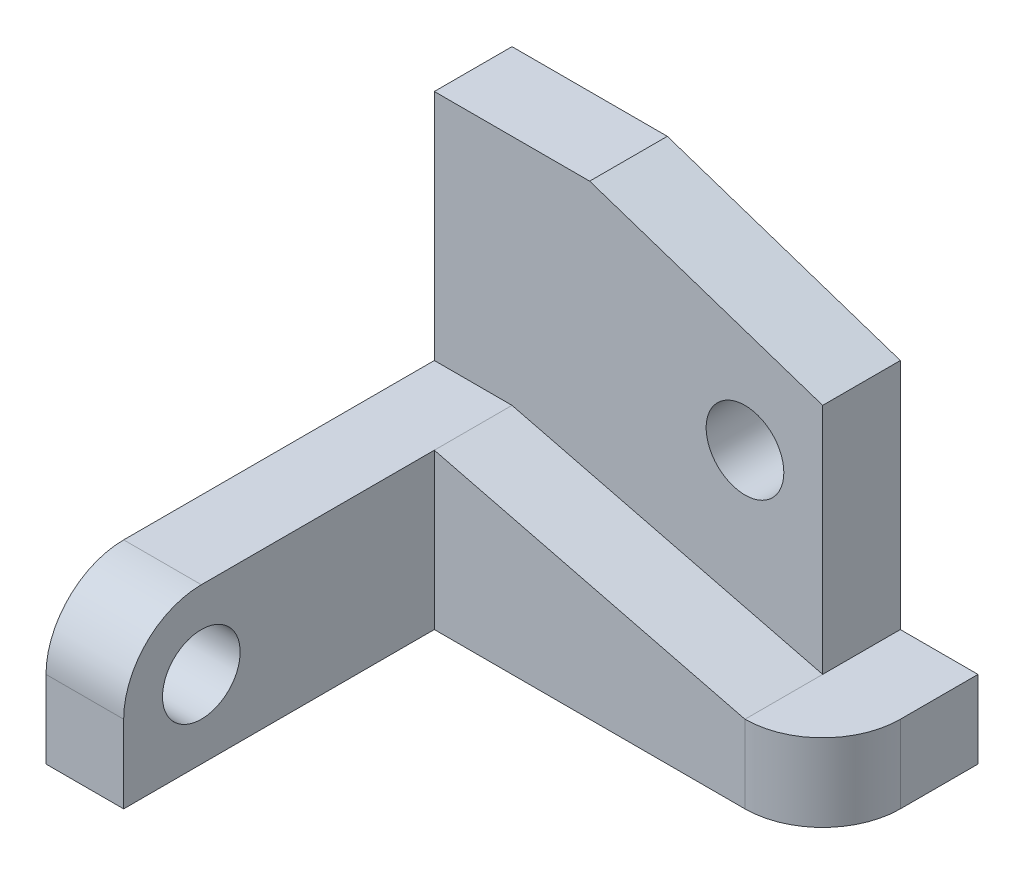
ISO-10303-21;
HEADER;
FILE_DESCRIPTION(('STEP AP214'),'2;1');
FILE_NAME('part.step','',(''),(''),'','','');
FILE_SCHEMA(('AUTOMOTIVE_DESIGN { 1 0 10303 214 1 1 1 1 }'));
ENDSEC;
DATA;
#1=APPLICATION_CONTEXT('core data for automotive mechanical design processes');
#2=APPLICATION_PROTOCOL_DEFINITION('international standard','automotive_design',2000,#1);
#3=PRODUCT_CONTEXT('',#1,'mechanical');
#4=PRODUCT('Part','Part','',(#3));
#5=PRODUCT_RELATED_PRODUCT_CATEGORY('part','',(#4));
#6=PRODUCT_DEFINITION_FORMATION('','',#4);
#7=PRODUCT_DEFINITION_CONTEXT('part definition',#1,'design');
#8=PRODUCT_DEFINITION('design','',#6,#7);
#9=PRODUCT_DEFINITION_SHAPE('','',#8);
#10=(LENGTH_UNIT() NAMED_UNIT(*) SI_UNIT(.MILLI.,.METRE.));
#11=(NAMED_UNIT(*) PLANE_ANGLE_UNIT() SI_UNIT($,.RADIAN.));
#12=(NAMED_UNIT(*) SI_UNIT($,.STERADIAN.) SOLID_ANGLE_UNIT());
#13=UNCERTAINTY_MEASURE_WITH_UNIT(LENGTH_MEASURE(1.E-05),#10,'distance_accuracy_value','');
#14=(GEOMETRIC_REPRESENTATION_CONTEXT(3) GLOBAL_UNCERTAINTY_ASSIGNED_CONTEXT((#13)) GLOBAL_UNIT_ASSIGNED_CONTEXT((#10,
#11,#12)) REPRESENTATION_CONTEXT('',''));
#15=CARTESIAN_POINT('',(0.,0.,0.));
#16=DIRECTION('',(0.,0.,1.));
#17=DIRECTION('',(1.,0.,0.));
#18=AXIS2_PLACEMENT_3D('',#15,#16,#17);
#19=CARTESIAN_POINT('',(-38.1619937694704,-27.7258566978193,10.));
#20=DIRECTION('',(0.,1.,0.));
#21=DIRECTION('',(0.,0.,1.));
#22=AXIS2_PLACEMENT_3D('',#19,#20,#21);
#23=PLANE('',#22);
#24=CARTESIAN_POINT('',(11.8380062305296,-27.7258566978193,10.));
#25=DIRECTION('',(0.,1.,0.));
#26=DIRECTION('',(0.,0.,1.));
#27=AXIS2_PLACEMENT_3D('',#24,#25,#26);
#28=CIRCLE('',#27,10.);
#29=CARTESIAN_POINT('',(11.8380062305295,-27.7258566978193,20.));
#30=VERTEX_POINT('',#29);
#31=CARTESIAN_POINT('',(21.8380062305296,-27.7258566978193,9.99999999999993));
#32=VERTEX_POINT('',#31);
#33=EDGE_CURVE('E150',#30,#32,#28,.T.);
#34=ORIENTED_EDGE('',*,*,#33,.F.);
#35=DIRECTION('',(1.,0.,0.));
#36=VECTOR('',#35,1.);
#37=CARTESIAN_POINT('',(-28.1619937694704,-27.7258566978193,20.));
#38=LINE('',#37,#36);
#39=CARTESIAN_POINT('',(-28.1619937694704,-27.7258566978193,20.));
#40=VERTEX_POINT('',#39);
#41=EDGE_CURVE('E181',#40,#30,#38,.T.);
#42=ORIENTED_EDGE('',*,*,#41,.F.);
#43=DIRECTION('',(0.,0.,1.));
#44=VECTOR('',#43,1.);
#45=CARTESIAN_POINT('',(-28.1619937694704,-27.7258566978193,10.));
#46=LINE('',#45,#44);
#47=CARTESIAN_POINT('',(-28.1619937694704,-27.7258566978193,60.));
#48=VERTEX_POINT('',#47);
#49=EDGE_CURVE('E194',#40,#48,#46,.T.);
#50=ORIENTED_EDGE('',*,*,#49,.T.);
#51=DIRECTION('',(-1.,0.,0.));
#52=VECTOR('',#51,1.);
#53=CARTESIAN_POINT('',(-28.1619937694704,-27.7258566978193,60.));
#54=LINE('',#53,#52);
#55=CARTESIAN_POINT('',(-38.1619937694704,-27.7258566978193,60.));
#56=VERTEX_POINT('',#55);
#57=EDGE_CURVE('E211',#48,#56,#54,.T.);
#58=ORIENTED_EDGE('',*,*,#57,.T.);
#59=DIRECTION('',(0.,0.,-1.));
#60=VECTOR('',#59,1.);
#61=CARTESIAN_POINT('',(-38.1619937694704,-27.7258566978193,10.));
#62=LINE('',#61,#60);
#63=CARTESIAN_POINT('',(-38.1619937694704,-27.7258566978193,0.));
#64=VERTEX_POINT('',#63);
#65=EDGE_CURVE('E272',#56,#64,#62,.T.);
#66=ORIENTED_EDGE('',*,*,#65,.T.);
#67=DIRECTION('',(1.,0.,0.));
#68=VECTOR('',#67,1.);
#69=CARTESIAN_POINT('',(-38.1619937694704,-27.7258566978193,0.));
#70=LINE('',#69,#68);
#71=CARTESIAN_POINT('',(21.8380062305296,-27.7258566978193,0.));
#72=VERTEX_POINT('',#71);
#73=EDGE_CURVE('E259',#64,#72,#70,.T.);
#74=ORIENTED_EDGE('',*,*,#73,.T.);
#75=DIRECTION('',(0.,0.,1.));
#76=VECTOR('',#75,1.);
#77=CARTESIAN_POINT('',(21.8380062305296,-27.7258566978193,0.));
#78=LINE('',#77,#76);
#79=EDGE_CURVE('E172',#72,#32,#78,.T.);
#80=ORIENTED_EDGE('',*,*,#79,.T.);
#81=EDGE_LOOP('',(#34,#42,#50,#58,#66,#74,#80));
#82=FACE_BOUND('',#81,.T.);
#83=ADVANCED_FACE('F40',(#82),#23,.F.);
#84=CARTESIAN_POINT('',(21.8380062305296,-17.7258566978193,0.));
#85=DIRECTION('',(0.,1.,0.));
#86=DIRECTION('',(0.,0.,1.));
#87=AXIS2_PLACEMENT_3D('',#84,#85,#86);
#88=PLANE('',#87);
#89=DIRECTION('',(0.,0.,1.));
#90=VECTOR('',#89,1.);
#91=CARTESIAN_POINT('',(11.8380062305296,-17.7258566978193,0.));
#92=LINE('',#91,#90);
#93=CARTESIAN_POINT('',(11.8380062305296,-17.7258566978193,10.));
#94=VERTEX_POINT('',#93);
#95=CARTESIAN_POINT('',(11.8380062305296,-17.7258566978193,20.));
#96=VERTEX_POINT('',#95);
#97=EDGE_CURVE('E163',#94,#96,#92,.T.);
#98=ORIENTED_EDGE('',*,*,#97,.T.);
#99=CARTESIAN_POINT('',(11.8380062305296,-17.7258566978193,10.));
#100=DIRECTION('',(0.,1.,0.));
#101=DIRECTION('',(0.,0.,-1.));
#102=AXIS2_PLACEMENT_3D('',#99,#100,#101);
#103=CIRCLE('',#102,10.);
#104=CARTESIAN_POINT('',(21.8380062305296,-17.7258566978193,9.99999999999993));
#105=VERTEX_POINT('',#104);
#106=EDGE_CURVE('E148',#96,#105,#103,.T.);
#107=ORIENTED_EDGE('',*,*,#106,.T.);
#108=DIRECTION('',(0.,0.,1.));
#109=VECTOR('',#108,1.);
#110=CARTESIAN_POINT('',(21.8380062305296,-17.7258566978193,0.));
#111=LINE('',#110,#109);
#112=CARTESIAN_POINT('',(21.8380062305296,-17.7258566978193,0.));
#113=VERTEX_POINT('',#112);
#114=EDGE_CURVE('E160',#113,#105,#111,.T.);
#115=ORIENTED_EDGE('',*,*,#114,.F.);
#116=DIRECTION('',(-1.,0.,0.));
#117=VECTOR('',#116,1.);
#118=CARTESIAN_POINT('',(21.8380062305296,-17.7258566978193,0.));
#119=LINE('',#118,#117);
#120=CARTESIAN_POINT('',(11.8380062305296,-17.7258566978193,0.));
#121=VERTEX_POINT('',#120);
#122=EDGE_CURVE('E481',#113,#121,#119,.T.);
#123=ORIENTED_EDGE('',*,*,#122,.T.);
#124=EDGE_CURVE('E178',#121,#94,#92,.T.);
#125=ORIENTED_EDGE('',*,*,#124,.T.);
#126=EDGE_LOOP('',(#98,#107,#115,#123,#125));
#127=FACE_BOUND('',#126,.T.);
#128=ADVANCED_FACE('F159',(#127),#88,.T.);
#129=CARTESIAN_POINT('',(0.,0.,10.));
#130=DIRECTION('',(0.,0.,1.));
#131=DIRECTION('',(1.,0.,0.));
#132=AXIS2_PLACEMENT_3D('',#129,#130,#131);
#133=PLANE('',#132);
#134=DIRECTION('',(-0.970142500145332,0.242535625036333,0.));
#135=VECTOR('',#134,1.);
#136=CARTESIAN_POINT('',(-3.47443650357339,-13.8977460142936,10.));
#137=LINE('',#136,#135);
#138=CARTESIAN_POINT('',(-28.1619937694704,-7.72585669781932,9.99999999999999));
#139=VERTEX_POINT('',#138);
#140=EDGE_CURVE('E171',#94,#139,#137,.T.);
#141=ORIENTED_EDGE('',*,*,#140,.F.);
#142=DIRECTION('',(0.,1.,0.));
#143=VECTOR('',#142,1.);
#144=CARTESIAN_POINT('',(11.8380062305296,-27.7258566978193,10.));
#145=LINE('',#144,#143);
#146=CARTESIAN_POINT('',(11.8380062305296,12.2741433021807,10.));
#147=VERTEX_POINT('',#146);
#148=EDGE_CURVE('E247',#94,#147,#145,.T.);
#149=ORIENTED_EDGE('',*,*,#148,.T.);
#150=DIRECTION('',(-0.948683298050514,0.316227766016838,0.));
#151=VECTOR('',#150,1.);
#152=CARTESIAN_POINT('',(11.8380062305296,12.2741433021807,10.));
#153=LINE('',#152,#151);
#154=CARTESIAN_POINT('',(-18.1619937694704,22.2741433021807,10.));
#155=VERTEX_POINT('',#154);
#156=EDGE_CURVE('E64',#147,#155,#153,.T.);
#157=ORIENTED_EDGE('',*,*,#156,.T.);
#158=DIRECTION('',(-1.,0.,0.));
#159=VECTOR('',#158,1.);
#160=CARTESIAN_POINT('',(-18.1619937694704,22.2741433021807,10.));
#161=LINE('',#160,#159);
#162=CARTESIAN_POINT('',(-38.1619937694704,22.2741433021807,10.));
#163=VERTEX_POINT('',#162);
#164=EDGE_CURVE('E242',#155,#163,#161,.T.);
#165=ORIENTED_EDGE('',*,*,#164,.T.);
#166=DIRECTION('',(0.,-1.,0.));
#167=VECTOR('',#166,1.);
#168=CARTESIAN_POINT('',(-38.1619937694704,22.2741433021807,10.));
#169=LINE('',#168,#167);
#170=CARTESIAN_POINT('',(-38.1619937694704,-7.72585669781932,10.));
#171=VERTEX_POINT('',#170);
#172=EDGE_CURVE('E91',#163,#171,#169,.T.);
#173=ORIENTED_EDGE('',*,*,#172,.T.);
#174=DIRECTION('',(-1.,0.,0.));
#175=VECTOR('',#174,1.);
#176=CARTESIAN_POINT('',(-28.1619937694704,-7.72585669781932,10.));
#177=LINE('',#176,#175);
#178=EDGE_CURVE('E221',#139,#171,#177,.T.);
#179=ORIENTED_EDGE('',*,*,#178,.F.);
#180=EDGE_LOOP('',(#141,#149,#157,#165,#173,#179));
#181=FACE_BOUND('',#180,.T.);
#182=CARTESIAN_POINT('',(1.83800623052959,2.27414330218068,10.));
#183=DIRECTION('',(0.,0.,1.));
#184=DIRECTION('',(1.,0.,0.));
#185=AXIS2_PLACEMENT_3D('',#182,#183,#184);
#186=CIRCLE('',#185,5.);
#187=CARTESIAN_POINT('',(6.8380062305296,2.27414330218068,10.));
#188=VERTEX_POINT('',#187);
#189=EDGE_CURVE('E234',#188,#188,#186,.T.);
#190=ORIENTED_EDGE('',*,*,#189,.F.);
#191=EDGE_LOOP('',(#190));
#192=FACE_BOUND('',#191,.T.);
#193=ADVANCED_FACE('F304',(#181,#192),#133,.T.);
#194=CARTESIAN_POINT('',(0.,0.,0.));
#195=DIRECTION('',(0.,0.,1.));
#196=DIRECTION('',(1.,0.,0.));
#197=AXIS2_PLACEMENT_3D('',#194,#195,#196);
#198=PLANE('',#197);
#199=DIRECTION('',(0.,1.,0.));
#200=VECTOR('',#199,1.);
#201=CARTESIAN_POINT('',(11.8380062305296,-27.7258566978193,0.));
#202=LINE('',#201,#200);
#203=CARTESIAN_POINT('',(11.8380062305296,12.2741433021807,0.));
#204=VERTEX_POINT('',#203);
#205=EDGE_CURVE('E262',#121,#204,#202,.T.);
#206=ORIENTED_EDGE('',*,*,#205,.F.);
#207=ORIENTED_EDGE('',*,*,#122,.F.);
#208=DIRECTION('',(0.,1.,0.));
#209=VECTOR('',#208,1.);
#210=CARTESIAN_POINT('',(21.8380062305296,-27.7258566978193,0.));
#211=LINE('',#210,#209);
#212=EDGE_CURVE('E169',#72,#113,#211,.T.);
#213=ORIENTED_EDGE('',*,*,#212,.F.);
#214=ORIENTED_EDGE('',*,*,#73,.F.);
#215=DIRECTION('',(0.,-1.,0.));
#216=VECTOR('',#215,1.);
#217=CARTESIAN_POINT('',(-38.1619937694704,22.2741433021807,0.));
#218=LINE('',#217,#216);
#219=CARTESIAN_POINT('',(-38.1619937694704,22.2741433021807,0.));
#220=VERTEX_POINT('',#219);
#221=EDGE_CURVE('E256',#220,#64,#218,.T.);
#222=ORIENTED_EDGE('',*,*,#221,.F.);
#223=DIRECTION('',(-1.,0.,0.));
#224=VECTOR('',#223,1.);
#225=CARTESIAN_POINT('',(-18.1619937694704,22.2741433021807,0.));
#226=LINE('',#225,#224);
#227=CARTESIAN_POINT('',(-18.1619937694704,22.2741433021807,0.));
#228=VERTEX_POINT('',#227);
#229=EDGE_CURVE('E238',#228,#220,#226,.T.);
#230=ORIENTED_EDGE('',*,*,#229,.F.);
#231=DIRECTION('',(-0.948683298050514,0.316227766016838,0.));
#232=VECTOR('',#231,1.);
#233=CARTESIAN_POINT('',(11.8380062305296,12.2741433021807,0.));
#234=LINE('',#233,#232);
#235=EDGE_CURVE('E84',#204,#228,#234,.T.);
#236=ORIENTED_EDGE('',*,*,#235,.F.);
#237=EDGE_LOOP('',(#206,#207,#213,#214,#222,#230,#236));
#238=FACE_BOUND('',#237,.T.);
#239=CARTESIAN_POINT('',(1.83800623052959,2.27414330218068,0.));
#240=DIRECTION('',(0.,0.,1.));
#241=DIRECTION('',(1.,0.,0.));
#242=AXIS2_PLACEMENT_3D('',#239,#240,#241);
#243=CIRCLE('',#242,5.);
#244=CARTESIAN_POINT('',(6.8380062305296,2.27414330218068,0.));
#245=VERTEX_POINT('',#244);
#246=EDGE_CURVE('E224',#245,#245,#243,.T.);
#247=ORIENTED_EDGE('',*,*,#246,.T.);
#248=EDGE_LOOP('',(#247));
#249=FACE_BOUND('',#248,.T.);
#250=ADVANCED_FACE('F284',(#238,#249),#198,.F.);
#251=CARTESIAN_POINT('',(-18.1619937694704,22.2741433021807,10.));
#252=DIRECTION('',(0.,-1.,0.));
#253=DIRECTION('',(0.,0.,-1.));
#254=AXIS2_PLACEMENT_3D('',#251,#252,#253);
#255=PLANE('',#254);
#256=ORIENTED_EDGE('',*,*,#229,.T.);
#257=DIRECTION('',(0.,0.,-1.));
#258=VECTOR('',#257,1.);
#259=CARTESIAN_POINT('',(-38.1619937694704,22.2741433021807,10.));
#260=LINE('',#259,#258);
#261=EDGE_CURVE('E49',#163,#220,#260,.T.);
#262=ORIENTED_EDGE('',*,*,#261,.F.);
#263=ORIENTED_EDGE('',*,*,#164,.F.);
#264=DIRECTION('',(0.,0.,-1.));
#265=VECTOR('',#264,1.);
#266=CARTESIAN_POINT('',(-18.1619937694704,22.2741433021807,10.));
#267=LINE('',#266,#265);
#268=EDGE_CURVE('E252',#155,#228,#267,.T.);
#269=ORIENTED_EDGE('',*,*,#268,.T.);
#270=EDGE_LOOP('',(#256,#262,#263,#269));
#271=FACE_BOUND('',#270,.T.);
#272=ADVANCED_FACE('F42',(#271),#255,.F.);
#273=CARTESIAN_POINT('',(-38.1619937694704,22.2741433021807,10.));
#274=DIRECTION('',(1.,0.,0.));
#275=DIRECTION('',(0.,0.,-1.));
#276=AXIS2_PLACEMENT_3D('',#273,#274,#275);
#277=PLANE('',#276);
#278=ORIENTED_EDGE('',*,*,#221,.T.);
#279=ORIENTED_EDGE('',*,*,#65,.F.);
#280=DIRECTION('',(0.,1.,0.));
#281=VECTOR('',#280,1.);
#282=CARTESIAN_POINT('',(-38.1619937694704,-17.7258566978194,60.));
#283=LINE('',#282,#281);
#284=CARTESIAN_POINT('',(-38.1619937694704,-17.7258566978194,60.));
#285=VERTEX_POINT('',#284);
#286=EDGE_CURVE('E190',#56,#285,#283,.T.);
#287=ORIENTED_EDGE('',*,*,#286,.T.);
#288=CARTESIAN_POINT('',(-38.1619937694704,-17.7258566978193,50.));
#289=DIRECTION('',(-1.,0.,0.));
#290=DIRECTION('',(0.,0.,1.));
#291=AXIS2_PLACEMENT_3D('',#288,#289,#290);
#292=CIRCLE('',#291,10.);
#293=CARTESIAN_POINT('',(-38.1619937694704,-7.72585669781932,49.9999999999999));
#294=VERTEX_POINT('',#293);
#295=EDGE_CURVE('E215',#285,#294,#292,.T.);
#296=ORIENTED_EDGE('',*,*,#295,.T.);
#297=DIRECTION('',(0.,0.,-1.));
#298=VECTOR('',#297,1.);
#299=CARTESIAN_POINT('',(-38.1619937694704,-7.72585669781932,10.));
#300=LINE('',#299,#298);
#301=EDGE_CURVE('E198',#294,#171,#300,.T.);
#302=ORIENTED_EDGE('',*,*,#301,.T.);
#303=ORIENTED_EDGE('',*,*,#172,.F.);
#304=ORIENTED_EDGE('',*,*,#261,.T.);
#305=EDGE_LOOP('',(#278,#279,#287,#296,#302,#303,#304));
#306=FACE_BOUND('',#305,.T.);
#307=CARTESIAN_POINT('',(-38.1619937694704,-17.7258566978193,50.));
#308=DIRECTION('',(-1.,0.,0.));
#309=DIRECTION('',(0.,0.,1.));
#310=AXIS2_PLACEMENT_3D('',#307,#308,#309);
#311=CIRCLE('',#310,5.);
#312=CARTESIAN_POINT('',(-38.1619937694704,-17.7258566978193,55.));
#313=VERTEX_POINT('',#312);
#314=EDGE_CURVE('E176',#313,#313,#311,.T.);
#315=ORIENTED_EDGE('',*,*,#314,.F.);
#316=EDGE_LOOP('',(#315));
#317=FACE_BOUND('',#316,.T.);
#318=ADVANCED_FACE('F277',(#306,#317),#277,.F.);
#319=CARTESIAN_POINT('',(11.8380062305296,-27.7258566978193,10.));
#320=DIRECTION('',(-1.,0.,0.));
#321=DIRECTION('',(0.,-1.,0.));
#322=AXIS2_PLACEMENT_3D('',#319,#320,#321);
#323=PLANE('',#322);
#324=ORIENTED_EDGE('',*,*,#148,.F.);
#325=ORIENTED_EDGE('',*,*,#124,.F.);
#326=ORIENTED_EDGE('',*,*,#205,.T.);
#327=DIRECTION('',(0.,0.,-1.));
#328=VECTOR('',#327,1.);
#329=CARTESIAN_POINT('',(11.8380062305296,12.2741433021807,10.));
#330=LINE('',#329,#328);
#331=EDGE_CURVE('E269',#147,#204,#330,.T.);
#332=ORIENTED_EDGE('',*,*,#331,.F.);
#333=EDGE_LOOP('',(#324,#325,#326,#332));
#334=FACE_BOUND('',#333,.T.);
#335=ADVANCED_FACE('F311',(#334),#323,.F.);
#336=CARTESIAN_POINT('',(11.8380062305296,12.2741433021807,10.));
#337=DIRECTION('',(-0.316227766016838,-0.948683298050514,0.));
#338=DIRECTION('',(0.948683298050514,-0.316227766016838,0.));
#339=AXIS2_PLACEMENT_3D('',#336,#337,#338);
#340=PLANE('',#339);
#341=ORIENTED_EDGE('',*,*,#235,.T.);
#342=ORIENTED_EDGE('',*,*,#268,.F.);
#343=ORIENTED_EDGE('',*,*,#156,.F.);
#344=ORIENTED_EDGE('',*,*,#331,.T.);
#345=EDGE_LOOP('',(#341,#342,#343,#344));
#346=FACE_BOUND('',#345,.T.);
#347=ADVANCED_FACE('F312',(#346),#340,.F.);
#348=CARTESIAN_POINT('',(1.83800623052959,2.27414330218068,10.));
#349=DIRECTION('',(0.,0.,-1.));
#350=DIRECTION('',(-1.,0.,0.));
#351=AXIS2_PLACEMENT_3D('',#348,#349,#350);
#352=CYLINDRICAL_SURFACE('',#351,5.);
#353=ORIENTED_EDGE('',*,*,#189,.T.);
#354=EDGE_LOOP('',(#353));
#355=FACE_BOUND('',#354,.T.);
#356=ORIENTED_EDGE('',*,*,#246,.F.);
#357=EDGE_LOOP('',(#356));
#358=FACE_BOUND('',#357,.T.);
#359=ADVANCED_FACE('F314',(#355,#358),#352,.F.);
#360=CARTESIAN_POINT('',(-28.1619937694704,-7.72585669781932,10.));
#361=DIRECTION('',(0.,1.,0.));
#362=DIRECTION('',(0.,0.,1.));
#363=AXIS2_PLACEMENT_3D('',#360,#361,#362);
#364=PLANE('',#363);
#365=ORIENTED_EDGE('',*,*,#301,.F.);
#366=DIRECTION('',(-1.,0.,0.));
#367=VECTOR('',#366,1.);
#368=CARTESIAN_POINT('',(-28.1619937694704,-7.72585669781932,49.9999999999999));
#369=LINE('',#368,#367);
#370=CARTESIAN_POINT('',(-28.1619937694704,-7.72585669781932,49.9999999999999));
#371=VERTEX_POINT('',#370);
#372=EDGE_CURVE('E225',#371,#294,#369,.T.);
#373=ORIENTED_EDGE('',*,*,#372,.F.);
#374=DIRECTION('',(0.,0.,-1.));
#375=VECTOR('',#374,1.);
#376=CARTESIAN_POINT('',(-28.1619937694704,-7.72585669781932,10.));
#377=LINE('',#376,#375);
#378=CARTESIAN_POINT('',(-28.1619937694704,-7.72585669781932,20.));
#379=VERTEX_POINT('',#378);
#380=EDGE_CURVE('E207',#371,#379,#377,.T.);
#381=ORIENTED_EDGE('',*,*,#380,.T.);
#382=EDGE_CURVE('E206',#379,#139,#377,.T.);
#383=ORIENTED_EDGE('',*,*,#382,.T.);
#384=ORIENTED_EDGE('',*,*,#178,.T.);
#385=EDGE_LOOP('',(#365,#373,#381,#383,#384));
#386=FACE_BOUND('',#385,.T.);
#387=ADVANCED_FACE('F300',(#386),#364,.T.);
#388=CARTESIAN_POINT('',(-28.1619937694704,-17.7258566978193,50.));
#389=DIRECTION('',(-1.,0.,0.));
#390=DIRECTION('',(0.,0.,1.));
#391=AXIS2_PLACEMENT_3D('',#388,#389,#390);
#392=CYLINDRICAL_SURFACE('',#391,10.);
#393=ORIENTED_EDGE('',*,*,#295,.F.);
#394=DIRECTION('',(-1.,0.,0.));
#395=VECTOR('',#394,1.);
#396=CARTESIAN_POINT('',(-28.1619937694704,-17.7258566978194,60.));
#397=LINE('',#396,#395);
#398=CARTESIAN_POINT('',(-28.1619937694704,-17.7258566978194,60.));
#399=VERTEX_POINT('',#398);
#400=EDGE_CURVE('E228',#399,#285,#397,.T.);
#401=ORIENTED_EDGE('',*,*,#400,.F.);
#402=CARTESIAN_POINT('',(-28.1619937694704,-17.7258566978193,50.));
#403=DIRECTION('',(-1.,0.,0.));
#404=DIRECTION('',(0.,0.,1.));
#405=AXIS2_PLACEMENT_3D('',#402,#403,#404);
#406=CIRCLE('',#405,10.);
#407=EDGE_CURVE('E202',#399,#371,#406,.T.);
#408=ORIENTED_EDGE('',*,*,#407,.T.);
#409=ORIENTED_EDGE('',*,*,#372,.T.);
#410=EDGE_LOOP('',(#393,#401,#408,#409));
#411=FACE_BOUND('',#410,.T.);
#412=ADVANCED_FACE('F297',(#411),#392,.T.);
#413=CARTESIAN_POINT('',(-28.1619937694704,-17.7258566978194,60.));
#414=DIRECTION('',(0.,0.,1.));
#415=DIRECTION('',(1.,0.,0.));
#416=AXIS2_PLACEMENT_3D('',#413,#414,#415);
#417=PLANE('',#416);
#418=ORIENTED_EDGE('',*,*,#286,.F.);
#419=ORIENTED_EDGE('',*,*,#57,.F.);
#420=DIRECTION('',(0.,1.,0.));
#421=VECTOR('',#420,1.);
#422=CARTESIAN_POINT('',(-28.1619937694704,-17.7258566978194,60.));
#423=LINE('',#422,#421);
#424=EDGE_CURVE('E197',#48,#399,#423,.T.);
#425=ORIENTED_EDGE('',*,*,#424,.T.);
#426=ORIENTED_EDGE('',*,*,#400,.T.);
#427=EDGE_LOOP('',(#418,#419,#425,#426));
#428=FACE_BOUND('',#427,.T.);
#429=ADVANCED_FACE('F293',(#428),#417,.T.);
#430=CARTESIAN_POINT('',(-28.1619937694704,-17.7258566978193,50.));
#431=DIRECTION('',(-1.,0.,0.));
#432=DIRECTION('',(0.,0.,1.));
#433=AXIS2_PLACEMENT_3D('',#430,#431,#432);
#434=PLANE('',#433);
#435=CARTESIAN_POINT('',(-28.1619937694704,-17.7258566978193,50.));
#436=DIRECTION('',(-1.,0.,0.));
#437=DIRECTION('',(0.,0.,1.));
#438=AXIS2_PLACEMENT_3D('',#435,#436,#437);
#439=CIRCLE('',#438,5.);
#440=CARTESIAN_POINT('',(-28.1619937694704,-17.7258566978193,55.));
#441=VERTEX_POINT('',#440);
#442=EDGE_CURVE('E186',#441,#441,#439,.T.);
#443=ORIENTED_EDGE('',*,*,#442,.T.);
#444=EDGE_LOOP('',(#443));
#445=FACE_BOUND('',#444,.T.);
#446=ORIENTED_EDGE('',*,*,#49,.F.);
#447=DIRECTION('',(0.,-1.,0.));
#448=VECTOR('',#447,1.);
#449=CARTESIAN_POINT('',(-28.1619937694704,-7.72585669781932,20.));
#450=LINE('',#449,#448);
#451=EDGE_CURVE('E478',#379,#40,#450,.T.);
#452=ORIENTED_EDGE('',*,*,#451,.F.);
#453=ORIENTED_EDGE('',*,*,#380,.F.);
#454=ORIENTED_EDGE('',*,*,#407,.F.);
#455=ORIENTED_EDGE('',*,*,#424,.F.);
#456=EDGE_LOOP('',(#446,#452,#453,#454,#455));
#457=FACE_BOUND('',#456,.T.);
#458=ADVANCED_FACE('F344',(#445,#457),#434,.F.);
#459=CARTESIAN_POINT('',(-28.1619937694704,-17.7258566978193,50.));
#460=DIRECTION('',(-1.,0.,0.));
#461=DIRECTION('',(0.,0.,1.));
#462=AXIS2_PLACEMENT_3D('',#459,#460,#461);
#463=CYLINDRICAL_SURFACE('',#462,5.);
#464=ORIENTED_EDGE('',*,*,#442,.F.);
#465=EDGE_LOOP('',(#464));
#466=FACE_BOUND('',#465,.T.);
#467=ORIENTED_EDGE('',*,*,#314,.T.);
#468=EDGE_LOOP('',(#467));
#469=FACE_BOUND('',#468,.T.);
#470=ADVANCED_FACE('F351',(#466,#469),#463,.F.);
#471=CARTESIAN_POINT('',(21.8380062305296,-27.7258566978193,0.));
#472=DIRECTION('',(1.,0.,0.));
#473=DIRECTION('',(0.,0.,-1.));
#474=AXIS2_PLACEMENT_3D('',#471,#472,#473);
#475=PLANE('',#474);
#476=DIRECTION('',(0.,1.,0.));
#477=VECTOR('',#476,1.);
#478=CARTESIAN_POINT('',(21.8380062305296,-37.7258566978193,9.99999999999993));
#479=LINE('',#478,#477);
#480=EDGE_CURVE('E144',#32,#105,#479,.T.);
#481=ORIENTED_EDGE('',*,*,#480,.F.);
#482=ORIENTED_EDGE('',*,*,#79,.F.);
#483=ORIENTED_EDGE('',*,*,#212,.T.);
#484=ORIENTED_EDGE('',*,*,#114,.T.);
#485=EDGE_LOOP('',(#481,#482,#483,#484));
#486=FACE_BOUND('',#485,.T.);
#487=ADVANCED_FACE('F167',(#486),#475,.T.);
#488=CARTESIAN_POINT('',(11.8380062305296,-17.7258566978193,0.));
#489=DIRECTION('',(0.242535625036333,0.970142500145332,0.));
#490=DIRECTION('',(-0.970142500145332,0.242535625036333,0.));
#491=AXIS2_PLACEMENT_3D('',#488,#489,#490);
#492=PLANE('',#491);
#493=ORIENTED_EDGE('',*,*,#97,.F.);
#494=ORIENTED_EDGE('',*,*,#140,.T.);
#495=ORIENTED_EDGE('',*,*,#382,.F.);
#496=DIRECTION('',(-0.970142500145332,0.242535625036333,0.));
#497=VECTOR('',#496,1.);
#498=CARTESIAN_POINT('',(11.8380062305296,-17.7258566978193,20.));
#499=LINE('',#498,#497);
#500=EDGE_CURVE('E55',#96,#379,#499,.T.);
#501=ORIENTED_EDGE('',*,*,#500,.F.);
#502=EDGE_LOOP('',(#493,#494,#495,#501));
#503=FACE_BOUND('',#502,.T.);
#504=ADVANCED_FACE('F356',(#503),#492,.T.);
#505=CARTESIAN_POINT('',(0.,0.,20.));
#506=DIRECTION('',(0.,0.,1.));
#507=DIRECTION('',(1.,0.,0.));
#508=AXIS2_PLACEMENT_3D('',#505,#506,#507);
#509=PLANE('',#508);
#510=DIRECTION('',(0.,1.,0.));
#511=VECTOR('',#510,1.);
#512=CARTESIAN_POINT('',(11.8380062305296,-37.7258566978193,20.));
#513=LINE('',#512,#511);
#514=EDGE_CURVE('E12',#30,#96,#513,.T.);
#515=ORIENTED_EDGE('',*,*,#514,.T.);
#516=ORIENTED_EDGE('',*,*,#500,.T.);
#517=ORIENTED_EDGE('',*,*,#451,.T.);
#518=ORIENTED_EDGE('',*,*,#41,.T.);
#519=EDGE_LOOP('',(#515,#516,#517,#518));
#520=FACE_BOUND('',#519,.T.);
#521=ADVANCED_FACE('F359',(#520),#509,.T.);
#522=CARTESIAN_POINT('',(11.8380062305296,-37.7258566978193,10.));
#523=DIRECTION('',(0.,1.,0.));
#524=DIRECTION('',(0.,0.,1.));
#525=AXIS2_PLACEMENT_3D('',#522,#523,#524);
#526=CYLINDRICAL_SURFACE('',#525,10.);
#527=ORIENTED_EDGE('',*,*,#33,.T.);
#528=ORIENTED_EDGE('',*,*,#480,.T.);
#529=ORIENTED_EDGE('',*,*,#106,.F.);
#530=ORIENTED_EDGE('',*,*,#514,.F.);
#531=EDGE_LOOP('',(#527,#528,#529,#530));
#532=FACE_BOUND('',#531,.T.);
#533=ADVANCED_FACE('F146',(#532),#526,.T.);
#534=CLOSED_SHELL('',(#83,#128,#193,#250,#272,#318,#335,#347,#359,#387,#412,#429,#458,#470,#487,
#504,#521,#533));
#535=MANIFOLD_SOLID_BREP('B2',#534);
#536=ADVANCED_BREP_SHAPE_REPRESENTATION('',(#18,#535),#14);
#537=SHAPE_DEFINITION_REPRESENTATION(#9,#536);
ENDSEC;
END-ISO-10303-21;
